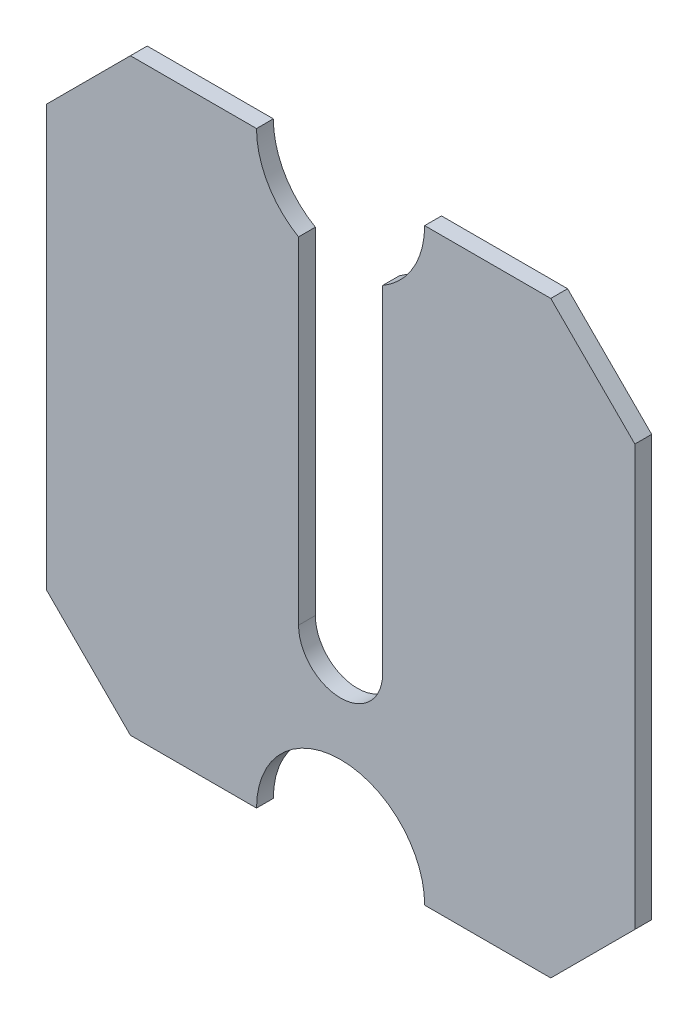
ISO-10303-21;
HEADER;
FILE_DESCRIPTION(('STEP AP214'),'2;1');
FILE_NAME('part.step','',(''),(''),'','','');
FILE_SCHEMA(('AUTOMOTIVE_DESIGN { 1 0 10303 214 1 1 1 1 }'));
ENDSEC;
DATA;
#1=APPLICATION_CONTEXT('core data for automotive mechanical design processes');
#2=APPLICATION_PROTOCOL_DEFINITION('international standard','automotive_design',2000,#1);
#3=PRODUCT_CONTEXT('',#1,'mechanical');
#4=PRODUCT('Part','Part','',(#3));
#5=PRODUCT_RELATED_PRODUCT_CATEGORY('part','',(#4));
#6=PRODUCT_DEFINITION_FORMATION('','',#4);
#7=PRODUCT_DEFINITION_CONTEXT('part definition',#1,'design');
#8=PRODUCT_DEFINITION('design','',#6,#7);
#9=PRODUCT_DEFINITION_SHAPE('','',#8);
#10=(LENGTH_UNIT() NAMED_UNIT(*) SI_UNIT(.MILLI.,.METRE.));
#11=(NAMED_UNIT(*) PLANE_ANGLE_UNIT() SI_UNIT($,.RADIAN.));
#12=(NAMED_UNIT(*) SI_UNIT($,.STERADIAN.) SOLID_ANGLE_UNIT());
#13=UNCERTAINTY_MEASURE_WITH_UNIT(LENGTH_MEASURE(1.E-05),#10,'distance_accuracy_value','');
#14=(GEOMETRIC_REPRESENTATION_CONTEXT(3) GLOBAL_UNCERTAINTY_ASSIGNED_CONTEXT((#13)) GLOBAL_UNIT_ASSIGNED_CONTEXT((#10,
#11,#12)) REPRESENTATION_CONTEXT('',''));
#15=CARTESIAN_POINT('',(0.,0.,0.));
#16=DIRECTION('',(0.,0.,1.));
#17=DIRECTION('',(1.,0.,0.));
#18=AXIS2_PLACEMENT_3D('',#15,#16,#17);
#19=CARTESIAN_POINT('',(0.,-175.,10.));
#20=DIRECTION('',(0.,0.,-1.));
#21=DIRECTION('',(-1.,0.,0.));
#22=AXIS2_PLACEMENT_3D('',#19,#20,#21);
#23=CYLINDRICAL_SURFACE('',#22,50.);
#24=CARTESIAN_POINT('',(0.,-175.,0.));
#25=DIRECTION('',(0.,0.,-1.));
#26=DIRECTION('',(1.,0.,0.));
#27=AXIS2_PLACEMENT_3D('',#24,#25,#26);
#28=CIRCLE('',#27,50.);
#29=CARTESIAN_POINT('',(-50.,-175.,0.));
#30=VERTEX_POINT('',#29);
#31=CARTESIAN_POINT('',(50.,-175.,0.));
#32=VERTEX_POINT('',#31);
#33=EDGE_CURVE('E180',#30,#32,#28,.T.);
#34=ORIENTED_EDGE('',*,*,#33,.T.);
#35=DIRECTION('',(0.,0.,-1.));
#36=VECTOR('',#35,1.);
#37=CARTESIAN_POINT('',(50.,-175.,10.));
#38=LINE('',#37,#36);
#39=CARTESIAN_POINT('',(50.,-175.,10.));
#40=VERTEX_POINT('',#39);
#41=EDGE_CURVE('E11',#40,#32,#38,.T.);
#42=ORIENTED_EDGE('',*,*,#41,.F.);
#43=CARTESIAN_POINT('',(0.,-175.,10.));
#44=DIRECTION('',(0.,0.,-1.));
#45=DIRECTION('',(1.,0.,0.));
#46=AXIS2_PLACEMENT_3D('',#43,#44,#45);
#47=CIRCLE('',#46,50.);
#48=CARTESIAN_POINT('',(-50.,-175.,10.));
#49=VERTEX_POINT('',#48);
#50=EDGE_CURVE('E210',#49,#40,#47,.T.);
#51=ORIENTED_EDGE('',*,*,#50,.F.);
#52=DIRECTION('',(0.,0.,-1.));
#53=VECTOR('',#52,1.);
#54=CARTESIAN_POINT('',(-50.,-175.,10.));
#55=LINE('',#54,#53);
#56=EDGE_CURVE('E176',#49,#30,#55,.T.);
#57=ORIENTED_EDGE('',*,*,#56,.T.);
#58=EDGE_LOOP('',(#34,#42,#51,#57));
#59=FACE_BOUND('',#58,.T.);
#60=ADVANCED_FACE('F36',(#59),#23,.F.);
#61=CARTESIAN_POINT('',(50.,-175.,10.));
#62=DIRECTION('',(0.,1.,0.));
#63=DIRECTION('',(-1.,0.,0.));
#64=AXIS2_PLACEMENT_3D('',#61,#62,#63);
#65=PLANE('',#64);
#66=DIRECTION('',(1.,0.,0.));
#67=VECTOR('',#66,1.);
#68=CARTESIAN_POINT('',(50.,-175.,0.));
#69=LINE('',#68,#67);
#70=CARTESIAN_POINT('',(125.,-175.,0.));
#71=VERTEX_POINT('',#70);
#72=EDGE_CURVE('E183',#32,#71,#69,.T.);
#73=ORIENTED_EDGE('',*,*,#72,.T.);
#74=DIRECTION('',(0.,0.,-1.));
#75=VECTOR('',#74,1.);
#76=CARTESIAN_POINT('',(125.,-175.,10.));
#77=LINE('',#76,#75);
#78=CARTESIAN_POINT('',(125.,-175.,10.));
#79=VERTEX_POINT('',#78);
#80=EDGE_CURVE('E44',#79,#71,#77,.T.);
#81=ORIENTED_EDGE('',*,*,#80,.F.);
#82=DIRECTION('',(1.,0.,0.));
#83=VECTOR('',#82,1.);
#84=CARTESIAN_POINT('',(50.,-175.,10.));
#85=LINE('',#84,#83);
#86=EDGE_CURVE('E119',#40,#79,#85,.T.);
#87=ORIENTED_EDGE('',*,*,#86,.F.);
#88=ORIENTED_EDGE('',*,*,#41,.T.);
#89=EDGE_LOOP('',(#73,#81,#87,#88));
#90=FACE_BOUND('',#89,.T.);
#91=ADVANCED_FACE('F308',(#90),#65,.F.);
#92=CARTESIAN_POINT('',(125.,-175.,10.));
#93=DIRECTION('',(-0.707106781186546,0.707106781186549,0.));
#94=DIRECTION('',(-0.707106781186549,-0.707106781186546,0.));
#95=AXIS2_PLACEMENT_3D('',#92,#93,#94);
#96=PLANE('',#95);
#97=DIRECTION('',(0.707106781186549,0.707106781186546,0.));
#98=VECTOR('',#97,1.);
#99=CARTESIAN_POINT('',(125.,-175.,0.));
#100=LINE('',#99,#98);
#101=CARTESIAN_POINT('',(175.,-125.,0.));
#102=VERTEX_POINT('',#101);
#103=EDGE_CURVE('E185',#71,#102,#100,.T.);
#104=ORIENTED_EDGE('',*,*,#103,.T.);
#105=DIRECTION('',(0.,0.,-1.));
#106=VECTOR('',#105,1.);
#107=CARTESIAN_POINT('',(175.,-125.,10.));
#108=LINE('',#107,#106);
#109=CARTESIAN_POINT('',(175.,-125.,10.));
#110=VERTEX_POINT('',#109);
#111=EDGE_CURVE('E241',#110,#102,#108,.T.);
#112=ORIENTED_EDGE('',*,*,#111,.F.);
#113=DIRECTION('',(0.707106781186549,0.707106781186546,0.));
#114=VECTOR('',#113,1.);
#115=CARTESIAN_POINT('',(125.,-175.,10.));
#116=LINE('',#115,#114);
#117=EDGE_CURVE('E249',#79,#110,#116,.T.);
#118=ORIENTED_EDGE('',*,*,#117,.F.);
#119=ORIENTED_EDGE('',*,*,#80,.T.);
#120=EDGE_LOOP('',(#104,#112,#118,#119));
#121=FACE_BOUND('',#120,.T.);
#122=ADVANCED_FACE('F247',(#121),#96,.F.);
#123=CARTESIAN_POINT('',(175.,-125.,10.));
#124=DIRECTION('',(-1.,0.,0.));
#125=DIRECTION('',(0.,0.,1.));
#126=AXIS2_PLACEMENT_3D('',#123,#124,#125);
#127=PLANE('',#126);
#128=DIRECTION('',(0.,1.,0.));
#129=VECTOR('',#128,1.);
#130=CARTESIAN_POINT('',(175.,-125.,0.));
#131=LINE('',#130,#129);
#132=CARTESIAN_POINT('',(175.,125.,0.));
#133=VERTEX_POINT('',#132);
#134=EDGE_CURVE('E187',#102,#133,#131,.T.);
#135=ORIENTED_EDGE('',*,*,#134,.T.);
#136=DIRECTION('',(0.,0.,-1.));
#137=VECTOR('',#136,1.);
#138=CARTESIAN_POINT('',(175.,125.,10.));
#139=LINE('',#138,#137);
#140=CARTESIAN_POINT('',(175.,125.,10.));
#141=VERTEX_POINT('',#140);
#142=EDGE_CURVE('E238',#141,#133,#139,.T.);
#143=ORIENTED_EDGE('',*,*,#142,.F.);
#144=DIRECTION('',(0.,1.,0.));
#145=VECTOR('',#144,1.);
#146=CARTESIAN_POINT('',(175.,-125.,10.));
#147=LINE('',#146,#145);
#148=EDGE_CURVE('E267',#110,#141,#147,.T.);
#149=ORIENTED_EDGE('',*,*,#148,.F.);
#150=ORIENTED_EDGE('',*,*,#111,.T.);
#151=EDGE_LOOP('',(#135,#143,#149,#150));
#152=FACE_BOUND('',#151,.T.);
#153=ADVANCED_FACE('F258',(#152),#127,.F.);
#154=CARTESIAN_POINT('',(125.,175.,10.));
#155=DIRECTION('',(-0.707106781186546,-0.707106781186549,0.));
#156=DIRECTION('',(0.707106781186549,-0.707106781186546,0.));
#157=AXIS2_PLACEMENT_3D('',#154,#155,#156);
#158=PLANE('',#157);
#159=DIRECTION('',(-0.707106781186549,0.707106781186546,0.));
#160=VECTOR('',#159,1.);
#161=CARTESIAN_POINT('',(125.,175.,0.));
#162=LINE('',#161,#160);
#163=CARTESIAN_POINT('',(125.,175.,0.));
#164=VERTEX_POINT('',#163);
#165=EDGE_CURVE('E189',#133,#164,#162,.T.);
#166=ORIENTED_EDGE('',*,*,#165,.T.);
#167=DIRECTION('',(0.,0.,-1.));
#168=VECTOR('',#167,1.);
#169=CARTESIAN_POINT('',(125.,175.,10.));
#170=LINE('',#169,#168);
#171=CARTESIAN_POINT('',(125.,175.,10.));
#172=VERTEX_POINT('',#171);
#173=EDGE_CURVE('E235',#172,#164,#170,.T.);
#174=ORIENTED_EDGE('',*,*,#173,.F.);
#175=DIRECTION('',(-0.707106781186549,0.707106781186546,0.));
#176=VECTOR('',#175,1.);
#177=CARTESIAN_POINT('',(125.,175.,10.));
#178=LINE('',#177,#176);
#179=EDGE_CURVE('E264',#141,#172,#178,.T.);
#180=ORIENTED_EDGE('',*,*,#179,.F.);
#181=ORIENTED_EDGE('',*,*,#142,.T.);
#182=EDGE_LOOP('',(#166,#174,#180,#181));
#183=FACE_BOUND('',#182,.T.);
#184=ADVANCED_FACE('F262',(#183),#158,.F.);
#185=CARTESIAN_POINT('',(125.,175.,10.));
#186=DIRECTION('',(0.,-1.,0.));
#187=DIRECTION('',(1.,0.,0.));
#188=AXIS2_PLACEMENT_3D('',#185,#186,#187);
#189=PLANE('',#188);
#190=DIRECTION('',(-1.,0.,0.));
#191=VECTOR('',#190,1.);
#192=CARTESIAN_POINT('',(125.,175.,0.));
#193=LINE('',#192,#191);
#194=CARTESIAN_POINT('',(50.,175.,0.));
#195=VERTEX_POINT('',#194);
#196=EDGE_CURVE('E191',#164,#195,#193,.T.);
#197=ORIENTED_EDGE('',*,*,#196,.T.);
#198=DIRECTION('',(0.,0.,-1.));
#199=VECTOR('',#198,1.);
#200=CARTESIAN_POINT('',(50.,175.,10.));
#201=LINE('',#200,#199);
#202=CARTESIAN_POINT('',(50.,175.,10.));
#203=VERTEX_POINT('',#202);
#204=EDGE_CURVE('E232',#203,#195,#201,.T.);
#205=ORIENTED_EDGE('',*,*,#204,.F.);
#206=DIRECTION('',(-1.,0.,0.));
#207=VECTOR('',#206,1.);
#208=CARTESIAN_POINT('',(125.,175.,10.));
#209=LINE('',#208,#207);
#210=EDGE_CURVE('E266',#172,#203,#209,.T.);
#211=ORIENTED_EDGE('',*,*,#210,.F.);
#212=ORIENTED_EDGE('',*,*,#173,.T.);
#213=EDGE_LOOP('',(#197,#205,#211,#212));
#214=FACE_BOUND('',#213,.T.);
#215=ADVANCED_FACE('F321',(#214),#189,.F.);
#216=CARTESIAN_POINT('',(0.,175.,10.));
#217=DIRECTION('',(0.,0.,-1.));
#218=DIRECTION('',(-1.,0.,0.));
#219=AXIS2_PLACEMENT_3D('',#216,#217,#218);
#220=CYLINDRICAL_SURFACE('',#219,50.);
#221=CARTESIAN_POINT('',(0.,175.,0.));
#222=DIRECTION('',(0.,0.,-1.));
#223=DIRECTION('',(1.,0.,0.));
#224=AXIS2_PLACEMENT_3D('',#221,#222,#223);
#225=CIRCLE('',#224,50.);
#226=CARTESIAN_POINT('',(25.,131.698729810778,0.));
#227=VERTEX_POINT('',#226);
#228=EDGE_CURVE('E193',#195,#227,#225,.T.);
#229=ORIENTED_EDGE('',*,*,#228,.T.);
#230=DIRECTION('',(0.,0.,-1.));
#231=VECTOR('',#230,1.);
#232=CARTESIAN_POINT('',(25.,131.698729810778,10.));
#233=LINE('',#232,#231);
#234=CARTESIAN_POINT('',(25.,131.698729810778,10.));
#235=VERTEX_POINT('',#234);
#236=EDGE_CURVE('E229',#235,#227,#233,.T.);
#237=ORIENTED_EDGE('',*,*,#236,.F.);
#238=CARTESIAN_POINT('',(0.,175.,10.));
#239=DIRECTION('',(0.,0.,-1.));
#240=DIRECTION('',(1.,0.,0.));
#241=AXIS2_PLACEMENT_3D('',#238,#239,#240);
#242=CIRCLE('',#241,50.);
#243=EDGE_CURVE('E269',#203,#235,#242,.T.);
#244=ORIENTED_EDGE('',*,*,#243,.F.);
#245=ORIENTED_EDGE('',*,*,#204,.T.);
#246=EDGE_LOOP('',(#229,#237,#244,#245));
#247=FACE_BOUND('',#246,.T.);
#248=ADVANCED_FACE('F324',(#247),#220,.F.);
#249=CARTESIAN_POINT('',(25.,131.698729810778,10.));
#250=DIRECTION('',(1.,0.,0.));
#251=DIRECTION('',(0.,1.,0.));
#252=AXIS2_PLACEMENT_3D('',#249,#250,#251);
#253=PLANE('',#252);
#254=DIRECTION('',(0.,-1.,0.));
#255=VECTOR('',#254,1.);
#256=CARTESIAN_POINT('',(25.,131.698729810778,0.));
#257=LINE('',#256,#255);
#258=CARTESIAN_POINT('',(25.,-68.301270189222,0.));
#259=VERTEX_POINT('',#258);
#260=EDGE_CURVE('E195',#227,#259,#257,.T.);
#261=ORIENTED_EDGE('',*,*,#260,.T.);
#262=DIRECTION('',(0.,0.,-1.));
#263=VECTOR('',#262,1.);
#264=CARTESIAN_POINT('',(25.,-68.301270189222,10.));
#265=LINE('',#264,#263);
#266=CARTESIAN_POINT('',(25.,-68.301270189222,10.));
#267=VERTEX_POINT('',#266);
#268=EDGE_CURVE('E226',#267,#259,#265,.T.);
#269=ORIENTED_EDGE('',*,*,#268,.F.);
#270=DIRECTION('',(0.,-1.,0.));
#271=VECTOR('',#270,1.);
#272=CARTESIAN_POINT('',(25.,131.698729810778,10.));
#273=LINE('',#272,#271);
#274=EDGE_CURVE('E275',#235,#267,#273,.T.);
#275=ORIENTED_EDGE('',*,*,#274,.F.);
#276=ORIENTED_EDGE('',*,*,#236,.T.);
#277=EDGE_LOOP('',(#261,#269,#275,#276));
#278=FACE_BOUND('',#277,.T.);
#279=ADVANCED_FACE('F328',(#278),#253,.F.);
#280=CARTESIAN_POINT('',(0.,-68.301270189222,10.));
#281=DIRECTION('',(0.,0.,-1.));
#282=DIRECTION('',(-1.,0.,0.));
#283=AXIS2_PLACEMENT_3D('',#280,#281,#282);
#284=CYLINDRICAL_SURFACE('',#283,25.);
#285=CARTESIAN_POINT('',(0.,-68.301270189222,0.));
#286=DIRECTION('',(0.,0.,-1.));
#287=DIRECTION('',(1.,0.,0.));
#288=AXIS2_PLACEMENT_3D('',#285,#286,#287);
#289=CIRCLE('',#288,25.);
#290=CARTESIAN_POINT('',(-25.,-68.301270189222,0.));
#291=VERTEX_POINT('',#290);
#292=EDGE_CURVE('E197',#259,#291,#289,.T.);
#293=ORIENTED_EDGE('',*,*,#292,.T.);
#294=DIRECTION('',(0.,0.,-1.));
#295=VECTOR('',#294,1.);
#296=CARTESIAN_POINT('',(-25.,-68.301270189222,10.));
#297=LINE('',#296,#295);
#298=CARTESIAN_POINT('',(-25.,-68.301270189222,10.));
#299=VERTEX_POINT('',#298);
#300=EDGE_CURVE('E223',#299,#291,#297,.T.);
#301=ORIENTED_EDGE('',*,*,#300,.F.);
#302=CARTESIAN_POINT('',(0.,-68.301270189222,10.));
#303=DIRECTION('',(0.,0.,-1.));
#304=DIRECTION('',(1.,0.,0.));
#305=AXIS2_PLACEMENT_3D('',#302,#303,#304);
#306=CIRCLE('',#305,25.);
#307=EDGE_CURVE('E277',#267,#299,#306,.T.);
#308=ORIENTED_EDGE('',*,*,#307,.F.);
#309=ORIENTED_EDGE('',*,*,#268,.T.);
#310=EDGE_LOOP('',(#293,#301,#308,#309));
#311=FACE_BOUND('',#310,.T.);
#312=ADVANCED_FACE('F332',(#311),#284,.F.);
#313=CARTESIAN_POINT('',(-25.,131.698729810778,10.));
#314=DIRECTION('',(-1.,0.,0.));
#315=DIRECTION('',(0.,-1.,0.));
#316=AXIS2_PLACEMENT_3D('',#313,#314,#315);
#317=PLANE('',#316);
#318=DIRECTION('',(0.,1.,0.));
#319=VECTOR('',#318,1.);
#320=CARTESIAN_POINT('',(-25.,131.698729810778,0.));
#321=LINE('',#320,#319);
#322=CARTESIAN_POINT('',(-25.,131.698729810778,0.));
#323=VERTEX_POINT('',#322);
#324=EDGE_CURVE('E199',#291,#323,#321,.T.);
#325=ORIENTED_EDGE('',*,*,#324,.T.);
#326=DIRECTION('',(0.,0.,-1.));
#327=VECTOR('',#326,1.);
#328=CARTESIAN_POINT('',(-25.,131.698729810778,10.));
#329=LINE('',#328,#327);
#330=CARTESIAN_POINT('',(-25.,131.698729810778,10.));
#331=VERTEX_POINT('',#330);
#332=EDGE_CURVE('E220',#331,#323,#329,.T.);
#333=ORIENTED_EDGE('',*,*,#332,.F.);
#334=DIRECTION('',(0.,1.,0.));
#335=VECTOR('',#334,1.);
#336=CARTESIAN_POINT('',(-25.,131.698729810778,10.));
#337=LINE('',#336,#335);
#338=EDGE_CURVE('E279',#299,#331,#337,.T.);
#339=ORIENTED_EDGE('',*,*,#338,.F.);
#340=ORIENTED_EDGE('',*,*,#300,.T.);
#341=EDGE_LOOP('',(#325,#333,#339,#340));
#342=FACE_BOUND('',#341,.T.);
#343=ADVANCED_FACE('F336',(#342),#317,.F.);
#344=CARTESIAN_POINT('',(0.,175.,10.));
#345=DIRECTION('',(0.,0.,-1.));
#346=DIRECTION('',(-1.,0.,0.));
#347=AXIS2_PLACEMENT_3D('',#344,#345,#346);
#348=CYLINDRICAL_SURFACE('',#347,50.);
#349=CARTESIAN_POINT('',(0.,175.,0.));
#350=DIRECTION('',(0.,0.,-1.));
#351=DIRECTION('',(1.,0.,0.));
#352=AXIS2_PLACEMENT_3D('',#349,#350,#351);
#353=CIRCLE('',#352,50.);
#354=CARTESIAN_POINT('',(-49.9999999999999,175.,0.));
#355=VERTEX_POINT('',#354);
#356=EDGE_CURVE('E201',#323,#355,#353,.T.);
#357=ORIENTED_EDGE('',*,*,#356,.T.);
#358=DIRECTION('',(0.,0.,-1.));
#359=VECTOR('',#358,1.);
#360=CARTESIAN_POINT('',(-49.9999999999999,175.,10.));
#361=LINE('',#360,#359);
#362=CARTESIAN_POINT('',(-49.9999999999999,175.,10.));
#363=VERTEX_POINT('',#362);
#364=EDGE_CURVE('E217',#363,#355,#361,.T.);
#365=ORIENTED_EDGE('',*,*,#364,.F.);
#366=CARTESIAN_POINT('',(0.,175.,10.));
#367=DIRECTION('',(0.,0.,-1.));
#368=DIRECTION('',(1.,0.,0.));
#369=AXIS2_PLACEMENT_3D('',#366,#367,#368);
#370=CIRCLE('',#369,50.);
#371=EDGE_CURVE('E281',#331,#363,#370,.T.);
#372=ORIENTED_EDGE('',*,*,#371,.F.);
#373=ORIENTED_EDGE('',*,*,#332,.T.);
#374=EDGE_LOOP('',(#357,#365,#372,#373));
#375=FACE_BOUND('',#374,.T.);
#376=ADVANCED_FACE('F340',(#375),#348,.F.);
#377=CARTESIAN_POINT('',(-49.9999999999999,175.,10.));
#378=DIRECTION('',(0.,-1.,0.));
#379=DIRECTION('',(1.,0.,0.));
#380=AXIS2_PLACEMENT_3D('',#377,#378,#379);
#381=PLANE('',#380);
#382=DIRECTION('',(-1.,0.,0.));
#383=VECTOR('',#382,1.);
#384=CARTESIAN_POINT('',(-49.9999999999999,175.,0.));
#385=LINE('',#384,#383);
#386=CARTESIAN_POINT('',(-125.,175.,0.));
#387=VERTEX_POINT('',#386);
#388=EDGE_CURVE('E203',#355,#387,#385,.T.);
#389=ORIENTED_EDGE('',*,*,#388,.T.);
#390=DIRECTION('',(0.,0.,-1.));
#391=VECTOR('',#390,1.);
#392=CARTESIAN_POINT('',(-125.,175.,10.));
#393=LINE('',#392,#391);
#394=CARTESIAN_POINT('',(-125.,175.,10.));
#395=VERTEX_POINT('',#394);
#396=EDGE_CURVE('E214',#395,#387,#393,.T.);
#397=ORIENTED_EDGE('',*,*,#396,.F.);
#398=DIRECTION('',(-1.,0.,0.));
#399=VECTOR('',#398,1.);
#400=CARTESIAN_POINT('',(-49.9999999999999,175.,10.));
#401=LINE('',#400,#399);
#402=EDGE_CURVE('E283',#363,#395,#401,.T.);
#403=ORIENTED_EDGE('',*,*,#402,.F.);
#404=ORIENTED_EDGE('',*,*,#364,.T.);
#405=EDGE_LOOP('',(#389,#397,#403,#404));
#406=FACE_BOUND('',#405,.T.);
#407=ADVANCED_FACE('F289',(#406),#381,.F.);
#408=CARTESIAN_POINT('',(-125.,175.,10.));
#409=DIRECTION('',(0.707106781186548,-0.707106781186547,0.));
#410=DIRECTION('',(0.707106781186547,0.707106781186548,0.));
#411=AXIS2_PLACEMENT_3D('',#408,#409,#410);
#412=PLANE('',#411);
#413=DIRECTION('',(-0.707106781186547,-0.707106781186548,0.));
#414=VECTOR('',#413,1.);
#415=CARTESIAN_POINT('',(-125.,175.,0.));
#416=LINE('',#415,#414);
#417=CARTESIAN_POINT('',(-175.,125.,0.));
#418=VERTEX_POINT('',#417);
#419=EDGE_CURVE('E205',#387,#418,#416,.T.);
#420=ORIENTED_EDGE('',*,*,#419,.T.);
#421=DIRECTION('',(0.,0.,-1.));
#422=VECTOR('',#421,1.);
#423=CARTESIAN_POINT('',(-175.,125.,10.));
#424=LINE('',#423,#422);
#425=CARTESIAN_POINT('',(-175.,125.,10.));
#426=VERTEX_POINT('',#425);
#427=EDGE_CURVE('E171',#426,#418,#424,.T.);
#428=ORIENTED_EDGE('',*,*,#427,.F.);
#429=DIRECTION('',(-0.707106781186547,-0.707106781186548,0.));
#430=VECTOR('',#429,1.);
#431=CARTESIAN_POINT('',(-125.,175.,10.));
#432=LINE('',#431,#430);
#433=EDGE_CURVE('E162',#395,#426,#432,.T.);
#434=ORIENTED_EDGE('',*,*,#433,.F.);
#435=ORIENTED_EDGE('',*,*,#396,.T.);
#436=EDGE_LOOP('',(#420,#428,#434,#435));
#437=FACE_BOUND('',#436,.T.);
#438=ADVANCED_FACE('F293',(#437),#412,.F.);
#439=CARTESIAN_POINT('',(-175.,-125.,10.));
#440=DIRECTION('',(1.,0.,0.));
#441=DIRECTION('',(0.,0.,-1.));
#442=AXIS2_PLACEMENT_3D('',#439,#440,#441);
#443=PLANE('',#442);
#444=DIRECTION('',(0.,-1.,0.));
#445=VECTOR('',#444,1.);
#446=CARTESIAN_POINT('',(-175.,-125.,0.));
#447=LINE('',#446,#445);
#448=CARTESIAN_POINT('',(-175.,-125.,0.));
#449=VERTEX_POINT('',#448);
#450=EDGE_CURVE('E170',#418,#449,#447,.T.);
#451=ORIENTED_EDGE('',*,*,#450,.T.);
#452=DIRECTION('',(0.,0.,-1.));
#453=VECTOR('',#452,1.);
#454=CARTESIAN_POINT('',(-175.,-125.,10.));
#455=LINE('',#454,#453);
#456=CARTESIAN_POINT('',(-175.,-125.,10.));
#457=VERTEX_POINT('',#456);
#458=EDGE_CURVE('E167',#457,#449,#455,.T.);
#459=ORIENTED_EDGE('',*,*,#458,.F.);
#460=DIRECTION('',(0.,-1.,0.));
#461=VECTOR('',#460,1.);
#462=CARTESIAN_POINT('',(-175.,-125.,10.));
#463=LINE('',#462,#461);
#464=EDGE_CURVE('E156',#426,#457,#463,.T.);
#465=ORIENTED_EDGE('',*,*,#464,.F.);
#466=ORIENTED_EDGE('',*,*,#427,.T.);
#467=EDGE_LOOP('',(#451,#459,#465,#466));
#468=FACE_BOUND('',#467,.T.);
#469=ADVANCED_FACE('F168',(#468),#443,.F.);
#470=CARTESIAN_POINT('',(-125.,-175.,10.));
#471=DIRECTION('',(0.707106781186547,0.707106781186548,0.));
#472=DIRECTION('',(-0.707106781186548,0.707106781186547,0.));
#473=AXIS2_PLACEMENT_3D('',#470,#471,#472);
#474=PLANE('',#473);
#475=DIRECTION('',(0.707106781186548,-0.707106781186547,0.));
#476=VECTOR('',#475,1.);
#477=CARTESIAN_POINT('',(-125.,-175.,0.));
#478=LINE('',#477,#476);
#479=CARTESIAN_POINT('',(-125.,-175.,0.));
#480=VERTEX_POINT('',#479);
#481=EDGE_CURVE('E105',#449,#480,#478,.T.);
#482=ORIENTED_EDGE('',*,*,#481,.T.);
#483=DIRECTION('',(0.,0.,-1.));
#484=VECTOR('',#483,1.);
#485=CARTESIAN_POINT('',(-125.,-175.,10.));
#486=LINE('',#485,#484);
#487=CARTESIAN_POINT('',(-125.,-175.,10.));
#488=VERTEX_POINT('',#487);
#489=EDGE_CURVE('E172',#488,#480,#486,.T.);
#490=ORIENTED_EDGE('',*,*,#489,.F.);
#491=DIRECTION('',(0.707106781186548,-0.707106781186547,0.));
#492=VECTOR('',#491,1.);
#493=CARTESIAN_POINT('',(-125.,-175.,10.));
#494=LINE('',#493,#492);
#495=EDGE_CURVE('E160',#457,#488,#494,.T.);
#496=ORIENTED_EDGE('',*,*,#495,.F.);
#497=ORIENTED_EDGE('',*,*,#458,.T.);
#498=EDGE_LOOP('',(#482,#490,#496,#497));
#499=FACE_BOUND('',#498,.T.);
#500=ADVANCED_FACE('F174',(#499),#474,.F.);
#501=CARTESIAN_POINT('',(-125.,-175.,10.));
#502=DIRECTION('',(0.,1.,0.));
#503=DIRECTION('',(-1.,0.,0.));
#504=AXIS2_PLACEMENT_3D('',#501,#502,#503);
#505=PLANE('',#504);
#506=DIRECTION('',(1.,0.,0.));
#507=VECTOR('',#506,1.);
#508=CARTESIAN_POINT('',(-125.,-175.,0.));
#509=LINE('',#508,#507);
#510=EDGE_CURVE('E111',#480,#30,#509,.T.);
#511=ORIENTED_EDGE('',*,*,#510,.T.);
#512=ORIENTED_EDGE('',*,*,#56,.F.);
#513=DIRECTION('',(1.,0.,0.));
#514=VECTOR('',#513,1.);
#515=CARTESIAN_POINT('',(-125.,-175.,10.));
#516=LINE('',#515,#514);
#517=EDGE_CURVE('E52',#488,#49,#516,.T.);
#518=ORIENTED_EDGE('',*,*,#517,.F.);
#519=ORIENTED_EDGE('',*,*,#489,.T.);
#520=EDGE_LOOP('',(#511,#512,#518,#519));
#521=FACE_BOUND('',#520,.T.);
#522=ADVANCED_FACE('F297',(#521),#505,.F.);
#523=CARTESIAN_POINT('',(0.,-175.,10.));
#524=DIRECTION('',(0.,0.,1.));
#525=DIRECTION('',(1.,0.,0.));
#526=AXIS2_PLACEMENT_3D('',#523,#524,#525);
#527=PLANE('',#526);
#528=ORIENTED_EDGE('',*,*,#50,.T.);
#529=ORIENTED_EDGE('',*,*,#86,.T.);
#530=ORIENTED_EDGE('',*,*,#117,.T.);
#531=ORIENTED_EDGE('',*,*,#148,.T.);
#532=ORIENTED_EDGE('',*,*,#179,.T.);
#533=ORIENTED_EDGE('',*,*,#210,.T.);
#534=ORIENTED_EDGE('',*,*,#243,.T.);
#535=ORIENTED_EDGE('',*,*,#274,.T.);
#536=ORIENTED_EDGE('',*,*,#307,.T.);
#537=ORIENTED_EDGE('',*,*,#338,.T.);
#538=ORIENTED_EDGE('',*,*,#371,.T.);
#539=ORIENTED_EDGE('',*,*,#402,.T.);
#540=ORIENTED_EDGE('',*,*,#433,.T.);
#541=ORIENTED_EDGE('',*,*,#464,.T.);
#542=ORIENTED_EDGE('',*,*,#495,.T.);
#543=ORIENTED_EDGE('',*,*,#517,.T.);
#544=EDGE_LOOP('',(#528,#529,#530,#531,#532,#533,#534,#535,#536,#537,#538,#539,#540,#541,#542,#543));
#545=FACE_BOUND('',#544,.T.);
#546=ADVANCED_FACE('F158',(#545),#527,.T.);
#547=CARTESIAN_POINT('',(0.,-175.,0.));
#548=DIRECTION('',(0.,0.,1.));
#549=DIRECTION('',(1.,0.,0.));
#550=AXIS2_PLACEMENT_3D('',#547,#548,#549);
#551=PLANE('',#550);
#552=ORIENTED_EDGE('',*,*,#33,.F.);
#553=ORIENTED_EDGE('',*,*,#510,.F.);
#554=ORIENTED_EDGE('',*,*,#481,.F.);
#555=ORIENTED_EDGE('',*,*,#450,.F.);
#556=ORIENTED_EDGE('',*,*,#419,.F.);
#557=ORIENTED_EDGE('',*,*,#388,.F.);
#558=ORIENTED_EDGE('',*,*,#356,.F.);
#559=ORIENTED_EDGE('',*,*,#324,.F.);
#560=ORIENTED_EDGE('',*,*,#292,.F.);
#561=ORIENTED_EDGE('',*,*,#260,.F.);
#562=ORIENTED_EDGE('',*,*,#228,.F.);
#563=ORIENTED_EDGE('',*,*,#196,.F.);
#564=ORIENTED_EDGE('',*,*,#165,.F.);
#565=ORIENTED_EDGE('',*,*,#134,.F.);
#566=ORIENTED_EDGE('',*,*,#103,.F.);
#567=ORIENTED_EDGE('',*,*,#72,.F.);
#568=EDGE_LOOP('',(#552,#553,#554,#555,#556,#557,#558,#559,#560,#561,#562,#563,#564,#565,#566,#567));
#569=FACE_BOUND('',#568,.T.);
#570=ADVANCED_FACE('F253',(#569),#551,.F.);
#571=CLOSED_SHELL('',(#60,#91,#122,#153,#184,#215,#248,#279,#312,#343,#376,#407,#438,#469,#500,
#522,#546,#570));
#572=MANIFOLD_SOLID_BREP('B2',#571);
#573=ADVANCED_BREP_SHAPE_REPRESENTATION('',(#18,#572),#14);
#574=SHAPE_DEFINITION_REPRESENTATION(#9,#573);
ENDSEC;
END-ISO-10303-21;
